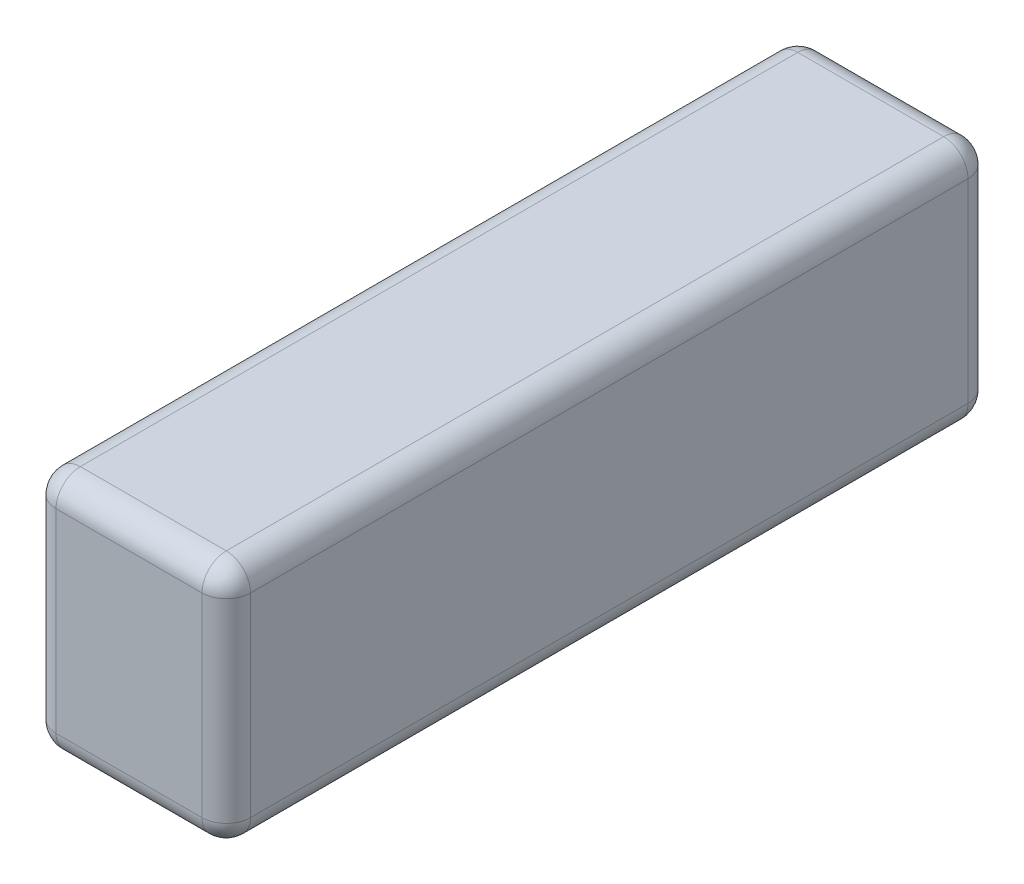
ISO-10303-21;
HEADER;
FILE_DESCRIPTION(('STEP AP214'),'2;1');
FILE_NAME('part.step','',(''),(''),'','','');
FILE_SCHEMA(('AUTOMOTIVE_DESIGN { 1 0 10303 214 1 1 1 1 }'));
ENDSEC;
DATA;
#1=APPLICATION_CONTEXT('core data for automotive mechanical design processes');
#2=APPLICATION_PROTOCOL_DEFINITION('international standard','automotive_design',2000,#1);
#3=PRODUCT_CONTEXT('',#1,'mechanical');
#4=PRODUCT('Part','Part','',(#3));
#5=PRODUCT_RELATED_PRODUCT_CATEGORY('part','',(#4));
#6=PRODUCT_DEFINITION_FORMATION('','',#4);
#7=PRODUCT_DEFINITION_CONTEXT('part definition',#1,'design');
#8=PRODUCT_DEFINITION('design','',#6,#7);
#9=PRODUCT_DEFINITION_SHAPE('','',#8);
#10=(LENGTH_UNIT() NAMED_UNIT(*) SI_UNIT(.MILLI.,.METRE.));
#11=(NAMED_UNIT(*) PLANE_ANGLE_UNIT() SI_UNIT($,.RADIAN.));
#12=(NAMED_UNIT(*) SI_UNIT($,.STERADIAN.) SOLID_ANGLE_UNIT());
#13=UNCERTAINTY_MEASURE_WITH_UNIT(LENGTH_MEASURE(1.E-05),#10,'distance_accuracy_value','');
#14=(GEOMETRIC_REPRESENTATION_CONTEXT(3) GLOBAL_UNCERTAINTY_ASSIGNED_CONTEXT((#13)) GLOBAL_UNIT_ASSIGNED_CONTEXT((#10,
#11,#12)) REPRESENTATION_CONTEXT('',''));
#15=CARTESIAN_POINT('',(0.,0.,0.));
#16=DIRECTION('',(0.,0.,1.));
#17=DIRECTION('',(1.,0.,0.));
#18=AXIS2_PLACEMENT_3D('',#15,#16,#17);
#19=CARTESIAN_POINT('',(8.,10.,63.));
#20=DIRECTION('',(-1.,0.,0.));
#21=DIRECTION('',(0.,-1.,0.));
#22=AXIS2_PLACEMENT_3D('',#19,#20,#21);
#23=PLANE('',#22);
#24=DIRECTION('',(0.,1.,0.));
#25=VECTOR('',#24,1.);
#26=CARTESIAN_POINT('',(8.00000000000001,-10.,61.));
#27=LINE('',#26,#25);
#28=CARTESIAN_POINT('',(8.,8.,61.));
#29=VERTEX_POINT('',#28);
#30=CARTESIAN_POINT('',(8.00000000000001,-8.,61.));
#31=VERTEX_POINT('',#30);
#32=EDGE_CURVE('E135',#29,#31,#27,.F.);
#33=ORIENTED_EDGE('',*,*,#32,.T.);
#34=DIRECTION('',(0.,0.,-1.));
#35=VECTOR('',#34,1.);
#36=CARTESIAN_POINT('',(8.00000000000001,-8.,63.));
#37=LINE('',#36,#35);
#38=CARTESIAN_POINT('',(8.00000000000001,-8.,2.));
#39=VERTEX_POINT('',#38);
#40=EDGE_CURVE('E171',#31,#39,#37,.T.);
#41=ORIENTED_EDGE('',*,*,#40,.T.);
#42=DIRECTION('',(0.,1.,0.));
#43=VECTOR('',#42,1.);
#44=CARTESIAN_POINT('',(8.,10.,2.));
#45=LINE('',#44,#43);
#46=CARTESIAN_POINT('',(8.,8.,2.));
#47=VERTEX_POINT('',#46);
#48=EDGE_CURVE('E164',#39,#47,#45,.T.);
#49=ORIENTED_EDGE('',*,*,#48,.T.);
#50=DIRECTION('',(0.,0.,-1.));
#51=VECTOR('',#50,1.);
#52=CARTESIAN_POINT('',(8.,8.,63.));
#53=LINE('',#52,#51);
#54=EDGE_CURVE('E162',#47,#29,#53,.F.);
#55=ORIENTED_EDGE('',*,*,#54,.T.);
#56=EDGE_LOOP('',(#33,#41,#49,#55));
#57=FACE_BOUND('',#56,.T.);
#58=ADVANCED_FACE('F39',(#57),#23,.F.);
#59=CARTESIAN_POINT('',(-8.,10.,63.));
#60=DIRECTION('',(0.,-1.,0.));
#61=DIRECTION('',(0.,0.,-1.));
#62=AXIS2_PLACEMENT_3D('',#59,#60,#61);
#63=PLANE('',#62);
#64=DIRECTION('',(-1.,0.,0.));
#65=VECTOR('',#64,1.);
#66=CARTESIAN_POINT('',(8.,10.,61.));
#67=LINE('',#66,#65);
#68=CARTESIAN_POINT('',(-6.,10.,61.));
#69=VERTEX_POINT('',#68);
#70=CARTESIAN_POINT('',(6.,10.,61.));
#71=VERTEX_POINT('',#70);
#72=EDGE_CURVE('E48',#69,#71,#67,.F.);
#73=ORIENTED_EDGE('',*,*,#72,.T.);
#74=DIRECTION('',(0.,0.,-1.));
#75=VECTOR('',#74,1.);
#76=CARTESIAN_POINT('',(6.,10.,63.));
#77=LINE('',#76,#75);
#78=CARTESIAN_POINT('',(6.,10.,2.));
#79=VERTEX_POINT('',#78);
#80=EDGE_CURVE('E11',#71,#79,#77,.T.);
#81=ORIENTED_EDGE('',*,*,#80,.T.);
#82=DIRECTION('',(-1.,0.,0.));
#83=VECTOR('',#82,1.);
#84=CARTESIAN_POINT('',(-8.,10.,2.));
#85=LINE('',#84,#83);
#86=CARTESIAN_POINT('',(-6.,10.,2.));
#87=VERTEX_POINT('',#86);
#88=EDGE_CURVE('E200',#79,#87,#85,.T.);
#89=ORIENTED_EDGE('',*,*,#88,.T.);
#90=DIRECTION('',(0.,0.,-1.));
#91=VECTOR('',#90,1.);
#92=CARTESIAN_POINT('',(-6.,10.,63.));
#93=LINE('',#92,#91);
#94=EDGE_CURVE('E59',#87,#69,#93,.F.);
#95=ORIENTED_EDGE('',*,*,#94,.T.);
#96=EDGE_LOOP('',(#73,#81,#89,#95));
#97=FACE_BOUND('',#96,.T.);
#98=ADVANCED_FACE('F333',(#97),#63,.F.);
#99=CARTESIAN_POINT('',(-8.,10.,63.));
#100=DIRECTION('',(1.,0.,0.));
#101=DIRECTION('',(0.,1.,0.));
#102=AXIS2_PLACEMENT_3D('',#99,#100,#101);
#103=PLANE('',#102);
#104=DIRECTION('',(0.,0.,-1.));
#105=VECTOR('',#104,1.);
#106=CARTESIAN_POINT('',(-8.,-8.,63.));
#107=LINE('',#106,#105);
#108=CARTESIAN_POINT('',(-8.,-8.,2.));
#109=VERTEX_POINT('',#108);
#110=CARTESIAN_POINT('',(-8.,-8.,61.));
#111=VERTEX_POINT('',#110);
#112=EDGE_CURVE('E195',#109,#111,#107,.F.);
#113=ORIENTED_EDGE('',*,*,#112,.T.);
#114=DIRECTION('',(0.,-1.,0.));
#115=VECTOR('',#114,1.);
#116=CARTESIAN_POINT('',(-8.,10.,61.));
#117=LINE('',#116,#115);
#118=CARTESIAN_POINT('',(-8.,8.,61.));
#119=VERTEX_POINT('',#118);
#120=EDGE_CURVE('E197',#111,#119,#117,.F.);
#121=ORIENTED_EDGE('',*,*,#120,.T.);
#122=DIRECTION('',(0.,0.,-1.));
#123=VECTOR('',#122,1.);
#124=CARTESIAN_POINT('',(-8.,8.,63.));
#125=LINE('',#124,#123);
#126=CARTESIAN_POINT('',(-8.,8.,2.));
#127=VERTEX_POINT('',#126);
#128=EDGE_CURVE('E191',#119,#127,#125,.T.);
#129=ORIENTED_EDGE('',*,*,#128,.T.);
#130=DIRECTION('',(0.,-1.,0.));
#131=VECTOR('',#130,1.);
#132=CARTESIAN_POINT('',(-8.,10.,2.));
#133=LINE('',#132,#131);
#134=EDGE_CURVE('E193',#127,#109,#133,.T.);
#135=ORIENTED_EDGE('',*,*,#134,.T.);
#136=EDGE_LOOP('',(#113,#121,#129,#135));
#137=FACE_BOUND('',#136,.T.);
#138=ADVANCED_FACE('F284',(#137),#103,.F.);
#139=CARTESIAN_POINT('',(-8.,-10.,63.));
#140=DIRECTION('',(0.,1.,0.));
#141=DIRECTION('',(0.,0.,1.));
#142=AXIS2_PLACEMENT_3D('',#139,#140,#141);
#143=PLANE('',#142);
#144=DIRECTION('',(0.,0.,-1.));
#145=VECTOR('',#144,1.);
#146=CARTESIAN_POINT('',(6.00000000000001,-10.,63.));
#147=LINE('',#146,#145);
#148=CARTESIAN_POINT('',(6.00000000000001,-10.,2.));
#149=VERTEX_POINT('',#148);
#150=CARTESIAN_POINT('',(6.00000000000001,-10.,61.));
#151=VERTEX_POINT('',#150);
#152=EDGE_CURVE('E186',#149,#151,#147,.F.);
#153=ORIENTED_EDGE('',*,*,#152,.T.);
#154=DIRECTION('',(1.,0.,0.));
#155=VECTOR('',#154,1.);
#156=CARTESIAN_POINT('',(-8.,-10.,61.));
#157=LINE('',#156,#155);
#158=CARTESIAN_POINT('',(-6.,-10.,61.));
#159=VERTEX_POINT('',#158);
#160=EDGE_CURVE('E188',#151,#159,#157,.F.);
#161=ORIENTED_EDGE('',*,*,#160,.T.);
#162=DIRECTION('',(0.,0.,-1.));
#163=VECTOR('',#162,1.);
#164=CARTESIAN_POINT('',(-6.,-10.,63.));
#165=LINE('',#164,#163);
#166=CARTESIAN_POINT('',(-6.,-10.,2.));
#167=VERTEX_POINT('',#166);
#168=EDGE_CURVE('E182',#159,#167,#165,.T.);
#169=ORIENTED_EDGE('',*,*,#168,.T.);
#170=DIRECTION('',(1.,0.,0.));
#171=VECTOR('',#170,1.);
#172=CARTESIAN_POINT('',(-8.,-10.,2.));
#173=LINE('',#172,#171);
#174=EDGE_CURVE('E184',#167,#149,#173,.T.);
#175=ORIENTED_EDGE('',*,*,#174,.T.);
#176=EDGE_LOOP('',(#153,#161,#169,#175));
#177=FACE_BOUND('',#176,.T.);
#178=ADVANCED_FACE('F275',(#177),#143,.F.);
#179=CARTESIAN_POINT('',(0.,0.,63.));
#180=DIRECTION('',(0.,0.,1.));
#181=DIRECTION('',(1.,0.,0.));
#182=AXIS2_PLACEMENT_3D('',#179,#180,#181);
#183=PLANE('',#182);
#184=DIRECTION('',(1.,0.,0.));
#185=VECTOR('',#184,1.);
#186=CARTESIAN_POINT('',(8.00000000000001,-8.,63.));
#187=LINE('',#186,#185);
#188=CARTESIAN_POINT('',(-6.,-8.,63.));
#189=VERTEX_POINT('',#188);
#190=CARTESIAN_POINT('',(6.00000000000001,-8.,63.));
#191=VERTEX_POINT('',#190);
#192=EDGE_CURVE('E160',#189,#191,#187,.T.);
#193=ORIENTED_EDGE('',*,*,#192,.T.);
#194=DIRECTION('',(0.,1.,0.));
#195=VECTOR('',#194,1.);
#196=CARTESIAN_POINT('',(6.,10.,63.));
#197=LINE('',#196,#195);
#198=CARTESIAN_POINT('',(6.,8.,63.));
#199=VERTEX_POINT('',#198);
#200=EDGE_CURVE('E133',#191,#199,#197,.T.);
#201=ORIENTED_EDGE('',*,*,#200,.T.);
#202=DIRECTION('',(-1.,0.,0.));
#203=VECTOR('',#202,1.);
#204=CARTESIAN_POINT('',(-8.,8.,63.));
#205=LINE('',#204,#203);
#206=CARTESIAN_POINT('',(-6.,8.,63.));
#207=VERTEX_POINT('',#206);
#208=EDGE_CURVE('E150',#199,#207,#205,.T.);
#209=ORIENTED_EDGE('',*,*,#208,.T.);
#210=DIRECTION('',(0.,-1.,0.));
#211=VECTOR('',#210,1.);
#212=CARTESIAN_POINT('',(-6.,-10.,63.));
#213=LINE('',#212,#211);
#214=EDGE_CURVE('E156',#207,#189,#213,.T.);
#215=ORIENTED_EDGE('',*,*,#214,.T.);
#216=EDGE_LOOP('',(#193,#201,#209,#215));
#217=FACE_BOUND('',#216,.T.);
#218=ADVANCED_FACE('F158',(#217),#183,.T.);
#219=CARTESIAN_POINT('',(0.,0.,0.));
#220=DIRECTION('',(0.,0.,1.));
#221=DIRECTION('',(1.,0.,0.));
#222=AXIS2_PLACEMENT_3D('',#219,#220,#221);
#223=PLANE('',#222);
#224=DIRECTION('',(-1.,0.,0.));
#225=VECTOR('',#224,1.);
#226=CARTESIAN_POINT('',(0.,8.,0.));
#227=LINE('',#226,#225);
#228=CARTESIAN_POINT('',(-6.,8.,0.));
#229=VERTEX_POINT('',#228);
#230=CARTESIAN_POINT('',(6.,8.,0.));
#231=VERTEX_POINT('',#230);
#232=EDGE_CURVE('E173',#229,#231,#227,.F.);
#233=ORIENTED_EDGE('',*,*,#232,.T.);
#234=DIRECTION('',(0.,1.,0.));
#235=VECTOR('',#234,1.);
#236=CARTESIAN_POINT('',(6.,0.,0.));
#237=LINE('',#236,#235);
#238=CARTESIAN_POINT('',(6.00000000000001,-8.,0.));
#239=VERTEX_POINT('',#238);
#240=EDGE_CURVE('E179',#231,#239,#237,.F.);
#241=ORIENTED_EDGE('',*,*,#240,.T.);
#242=DIRECTION('',(1.,0.,0.));
#243=VECTOR('',#242,1.);
#244=CARTESIAN_POINT('',(0.,-8.,0.));
#245=LINE('',#244,#243);
#246=CARTESIAN_POINT('',(-6.,-8.,0.));
#247=VERTEX_POINT('',#246);
#248=EDGE_CURVE('E177',#239,#247,#245,.F.);
#249=ORIENTED_EDGE('',*,*,#248,.T.);
#250=DIRECTION('',(0.,-1.,0.));
#251=VECTOR('',#250,1.);
#252=CARTESIAN_POINT('',(-6.,0.,0.));
#253=LINE('',#252,#251);
#254=EDGE_CURVE('E175',#247,#229,#253,.F.);
#255=ORIENTED_EDGE('',*,*,#254,.T.);
#256=EDGE_LOOP('',(#233,#241,#249,#255));
#257=FACE_BOUND('',#256,.T.);
#258=ADVANCED_FACE('F302',(#257),#223,.F.);
#259=CARTESIAN_POINT('',(-6.,10.,2.));
#260=DIRECTION('',(0.,-1.,0.));
#261=DIRECTION('',(1.,0.,0.));
#262=AXIS2_PLACEMENT_3D('',#259,#260,#261);
#263=CYLINDRICAL_SURFACE('',#262,2.);
#264=CARTESIAN_POINT('',(-6.,-8.,2.));
#265=DIRECTION('',(0.,-1.,0.));
#266=DIRECTION('',(0.,0.,-1.));
#267=AXIS2_PLACEMENT_3D('',#264,#265,#266);
#268=CIRCLE('',#267,2.);
#269=EDGE_CURVE('E43',#109,#247,#268,.T.);
#270=ORIENTED_EDGE('',*,*,#269,.F.);
#271=ORIENTED_EDGE('',*,*,#134,.F.);
#272=CARTESIAN_POINT('',(-6.,8.,2.));
#273=DIRECTION('',(0.,1.,0.));
#274=DIRECTION('',(0.,0.,1.));
#275=AXIS2_PLACEMENT_3D('',#272,#273,#274);
#276=CIRCLE('',#275,2.);
#277=EDGE_CURVE('E252',#229,#127,#276,.T.);
#278=ORIENTED_EDGE('',*,*,#277,.F.);
#279=ORIENTED_EDGE('',*,*,#254,.F.);
#280=EDGE_LOOP('',(#270,#271,#278,#279));
#281=FACE_BOUND('',#280,.T.);
#282=ADVANCED_FACE('F41',(#281),#263,.T.);
#283=CARTESIAN_POINT('',(-6.,-8.,2.));
#284=DIRECTION('',(0.,0.,1.));
#285=DIRECTION('',(1.,0.,0.));
#286=AXIS2_PLACEMENT_3D('',#283,#284,#285);
#287=SPHERICAL_SURFACE('',#286,2.);
#288=CARTESIAN_POINT('',(-6.,-8.,2.));
#289=DIRECTION('',(0.,0.,-1.));
#290=DIRECTION('',(-1.,0.,0.));
#291=AXIS2_PLACEMENT_3D('',#288,#289,#290);
#292=CIRCLE('',#291,2.);
#293=EDGE_CURVE('E247',#109,#167,#292,.F.);
#294=ORIENTED_EDGE('',*,*,#293,.F.);
#295=ORIENTED_EDGE('',*,*,#269,.T.);
#296=CARTESIAN_POINT('',(-6.,-8.,2.));
#297=DIRECTION('',(-1.,0.,0.));
#298=DIRECTION('',(0.,0.,1.));
#299=AXIS2_PLACEMENT_3D('',#296,#297,#298);
#300=CIRCLE('',#299,2.);
#301=EDGE_CURVE('E250',#167,#247,#300,.F.);
#302=ORIENTED_EDGE('',*,*,#301,.F.);
#303=EDGE_LOOP('',(#294,#295,#302));
#304=FACE_BOUND('',#303,.T.);
#305=ADVANCED_FACE('F263',(#304),#287,.T.);
#306=CARTESIAN_POINT('',(-6.,8.,2.));
#307=DIRECTION('',(0.,0.,1.));
#308=DIRECTION('',(1.,0.,0.));
#309=AXIS2_PLACEMENT_3D('',#306,#307,#308);
#310=SPHERICAL_SURFACE('',#309,2.);
#311=CARTESIAN_POINT('',(-6.,8.,2.));
#312=DIRECTION('',(-1.,0.,0.));
#313=DIRECTION('',(0.,0.,1.));
#314=AXIS2_PLACEMENT_3D('',#311,#312,#313);
#315=CIRCLE('',#314,2.);
#316=EDGE_CURVE('E241',#229,#87,#315,.F.);
#317=ORIENTED_EDGE('',*,*,#316,.F.);
#318=ORIENTED_EDGE('',*,*,#277,.T.);
#319=CARTESIAN_POINT('',(-6.,8.,2.));
#320=DIRECTION('',(0.,0.,-1.));
#321=DIRECTION('',(-1.,0.,0.));
#322=AXIS2_PLACEMENT_3D('',#319,#320,#321);
#323=CIRCLE('',#322,2.);
#324=EDGE_CURVE('E244',#87,#127,#323,.F.);
#325=ORIENTED_EDGE('',*,*,#324,.F.);
#326=EDGE_LOOP('',(#317,#318,#325));
#327=FACE_BOUND('',#326,.T.);
#328=ADVANCED_FACE('F295',(#327),#310,.T.);
#329=CARTESIAN_POINT('',(-8.,-8.,2.));
#330=DIRECTION('',(1.,0.,0.));
#331=DIRECTION('',(0.,0.,-1.));
#332=AXIS2_PLACEMENT_3D('',#329,#330,#331);
#333=CYLINDRICAL_SURFACE('',#332,2.);
#334=ORIENTED_EDGE('',*,*,#301,.T.);
#335=ORIENTED_EDGE('',*,*,#248,.F.);
#336=CARTESIAN_POINT('',(6.00000000000001,-8.,2.));
#337=DIRECTION('',(1.,0.,0.));
#338=DIRECTION('',(0.,0.,-1.));
#339=AXIS2_PLACEMENT_3D('',#336,#337,#338);
#340=CIRCLE('',#339,2.);
#341=EDGE_CURVE('E236',#149,#239,#340,.T.);
#342=ORIENTED_EDGE('',*,*,#341,.F.);
#343=ORIENTED_EDGE('',*,*,#174,.F.);
#344=EDGE_LOOP('',(#334,#335,#342,#343));
#345=FACE_BOUND('',#344,.T.);
#346=ADVANCED_FACE('F271',(#345),#333,.T.);
#347=CARTESIAN_POINT('',(-6.,-8.,63.));
#348=DIRECTION('',(0.,0.,-1.));
#349=DIRECTION('',(-1.,0.,0.));
#350=AXIS2_PLACEMENT_3D('',#347,#348,#349);
#351=CYLINDRICAL_SURFACE('',#350,2.);
#352=ORIENTED_EDGE('',*,*,#293,.T.);
#353=ORIENTED_EDGE('',*,*,#168,.F.);
#354=CARTESIAN_POINT('',(-6.,-8.,61.));
#355=DIRECTION('',(0.,0.,1.));
#356=DIRECTION('',(1.,0.,0.));
#357=AXIS2_PLACEMENT_3D('',#354,#355,#356);
#358=CIRCLE('',#357,2.);
#359=EDGE_CURVE('E233',#111,#159,#358,.T.);
#360=ORIENTED_EDGE('',*,*,#359,.F.);
#361=ORIENTED_EDGE('',*,*,#112,.F.);
#362=EDGE_LOOP('',(#352,#353,#360,#361));
#363=FACE_BOUND('',#362,.T.);
#364=ADVANCED_FACE('F281',(#363),#351,.T.);
#365=CARTESIAN_POINT('',(-6.,0.,61.));
#366=DIRECTION('',(0.,1.,0.));
#367=DIRECTION('',(-1.,0.,0.));
#368=AXIS2_PLACEMENT_3D('',#365,#366,#367);
#369=CYLINDRICAL_SURFACE('',#368,2.);
#370=CARTESIAN_POINT('',(-6.,8.,61.));
#371=DIRECTION('',(0.,1.,0.));
#372=DIRECTION('',(0.,0.,1.));
#373=AXIS2_PLACEMENT_3D('',#370,#371,#372);
#374=CIRCLE('',#373,2.);
#375=EDGE_CURVE('E227',#119,#207,#374,.T.);
#376=ORIENTED_EDGE('',*,*,#375,.F.);
#377=ORIENTED_EDGE('',*,*,#120,.F.);
#378=CARTESIAN_POINT('',(-6.,-8.,61.));
#379=DIRECTION('',(0.,-1.,0.));
#380=DIRECTION('',(0.,0.,-1.));
#381=AXIS2_PLACEMENT_3D('',#378,#379,#380);
#382=CIRCLE('',#381,2.);
#383=EDGE_CURVE('E230',#189,#111,#382,.T.);
#384=ORIENTED_EDGE('',*,*,#383,.F.);
#385=ORIENTED_EDGE('',*,*,#214,.F.);
#386=EDGE_LOOP('',(#376,#377,#384,#385));
#387=FACE_BOUND('',#386,.T.);
#388=ADVANCED_FACE('F288',(#387),#369,.T.);
#389=CARTESIAN_POINT('',(-6.,8.,63.));
#390=DIRECTION('',(0.,0.,-1.));
#391=DIRECTION('',(-1.,0.,0.));
#392=AXIS2_PLACEMENT_3D('',#389,#390,#391);
#393=CYLINDRICAL_SURFACE('',#392,2.);
#394=ORIENTED_EDGE('',*,*,#324,.T.);
#395=ORIENTED_EDGE('',*,*,#128,.F.);
#396=CARTESIAN_POINT('',(-6.,8.,61.));
#397=DIRECTION('',(0.,0.,1.));
#398=DIRECTION('',(1.,0.,0.));
#399=AXIS2_PLACEMENT_3D('',#396,#397,#398);
#400=CIRCLE('',#399,2.);
#401=EDGE_CURVE('E225',#69,#119,#400,.T.);
#402=ORIENTED_EDGE('',*,*,#401,.F.);
#403=ORIENTED_EDGE('',*,*,#94,.F.);
#404=EDGE_LOOP('',(#394,#395,#402,#403));
#405=FACE_BOUND('',#404,.T.);
#406=ADVANCED_FACE('F293',(#405),#393,.T.);
#407=CARTESIAN_POINT('',(-8.,8.,2.));
#408=DIRECTION('',(-1.,0.,0.));
#409=DIRECTION('',(0.,0.,1.));
#410=AXIS2_PLACEMENT_3D('',#407,#408,#409);
#411=CYLINDRICAL_SURFACE('',#410,2.);
#412=ORIENTED_EDGE('',*,*,#316,.T.);
#413=ORIENTED_EDGE('',*,*,#88,.F.);
#414=CARTESIAN_POINT('',(6.,8.,2.));
#415=DIRECTION('',(1.,0.,0.));
#416=DIRECTION('',(0.,1.,0.));
#417=AXIS2_PLACEMENT_3D('',#414,#415,#416);
#418=CIRCLE('',#417,2.);
#419=EDGE_CURVE('E222',#231,#79,#418,.T.);
#420=ORIENTED_EDGE('',*,*,#419,.F.);
#421=ORIENTED_EDGE('',*,*,#232,.F.);
#422=EDGE_LOOP('',(#412,#413,#420,#421));
#423=FACE_BOUND('',#422,.T.);
#424=ADVANCED_FACE('F299',(#423),#411,.T.);
#425=CARTESIAN_POINT('',(6.,10.,2.));
#426=DIRECTION('',(0.,1.,0.));
#427=DIRECTION('',(-1.,0.,0.));
#428=AXIS2_PLACEMENT_3D('',#425,#426,#427);
#429=CYLINDRICAL_SURFACE('',#428,2.);
#430=CARTESIAN_POINT('',(6.00000000000001,-8.,2.));
#431=DIRECTION('',(0.,-1.,0.));
#432=DIRECTION('',(1.,0.,0.));
#433=AXIS2_PLACEMENT_3D('',#430,#431,#432);
#434=CIRCLE('',#433,2.);
#435=EDGE_CURVE('E238',#239,#39,#434,.T.);
#436=ORIENTED_EDGE('',*,*,#435,.F.);
#437=ORIENTED_EDGE('',*,*,#240,.F.);
#438=CARTESIAN_POINT('',(6.,8.,2.));
#439=DIRECTION('',(0.,1.,0.));
#440=DIRECTION('',(0.,0.,1.));
#441=AXIS2_PLACEMENT_3D('',#438,#439,#440);
#442=CIRCLE('',#441,2.);
#443=EDGE_CURVE('E219',#47,#231,#442,.T.);
#444=ORIENTED_EDGE('',*,*,#443,.F.);
#445=ORIENTED_EDGE('',*,*,#48,.F.);
#446=EDGE_LOOP('',(#436,#437,#444,#445));
#447=FACE_BOUND('',#446,.T.);
#448=ADVANCED_FACE('F306',(#447),#429,.T.);
#449=CARTESIAN_POINT('',(6.00000000000001,-8.,2.));
#450=DIRECTION('',(0.,0.,1.));
#451=DIRECTION('',(1.,0.,0.));
#452=AXIS2_PLACEMENT_3D('',#449,#450,#451);
#453=SPHERICAL_SURFACE('',#452,2.);
#454=ORIENTED_EDGE('',*,*,#341,.T.);
#455=ORIENTED_EDGE('',*,*,#435,.T.);
#456=CARTESIAN_POINT('',(6.00000000000001,-8.,2.));
#457=DIRECTION('',(0.,0.,-1.));
#458=DIRECTION('',(-1.,0.,0.));
#459=AXIS2_PLACEMENT_3D('',#456,#457,#458);
#460=CIRCLE('',#459,2.);
#461=EDGE_CURVE('E216',#149,#39,#460,.F.);
#462=ORIENTED_EDGE('',*,*,#461,.F.);
#463=EDGE_LOOP('',(#454,#455,#462));
#464=FACE_BOUND('',#463,.T.);
#465=ADVANCED_FACE('F310',(#464),#453,.T.);
#466=CARTESIAN_POINT('',(-6.,-8.,61.));
#467=DIRECTION('',(0.,0.,1.));
#468=DIRECTION('',(1.,0.,0.));
#469=AXIS2_PLACEMENT_3D('',#466,#467,#468);
#470=SPHERICAL_SURFACE('',#469,2.);
#471=ORIENTED_EDGE('',*,*,#383,.T.);
#472=ORIENTED_EDGE('',*,*,#359,.T.);
#473=CARTESIAN_POINT('',(-6.,-8.,61.));
#474=DIRECTION('',(-1.,0.,0.));
#475=DIRECTION('',(0.,0.,1.));
#476=AXIS2_PLACEMENT_3D('',#473,#474,#475);
#477=CIRCLE('',#476,2.);
#478=EDGE_CURVE('E214',#189,#159,#477,.F.);
#479=ORIENTED_EDGE('',*,*,#478,.F.);
#480=EDGE_LOOP('',(#471,#472,#479));
#481=FACE_BOUND('',#480,.T.);
#482=ADVANCED_FACE('F321',(#481),#470,.T.);
#483=CARTESIAN_POINT('',(-6.,8.,61.));
#484=DIRECTION('',(0.,0.,1.));
#485=DIRECTION('',(1.,0.,0.));
#486=AXIS2_PLACEMENT_3D('',#483,#484,#485);
#487=SPHERICAL_SURFACE('',#486,2.);
#488=ORIENTED_EDGE('',*,*,#401,.T.);
#489=ORIENTED_EDGE('',*,*,#375,.T.);
#490=CARTESIAN_POINT('',(-6.,8.,61.));
#491=DIRECTION('',(-1.,0.,0.));
#492=DIRECTION('',(0.,0.,1.));
#493=AXIS2_PLACEMENT_3D('',#490,#491,#492);
#494=CIRCLE('',#493,2.);
#495=EDGE_CURVE('E153',#69,#207,#494,.F.);
#496=ORIENTED_EDGE('',*,*,#495,.F.);
#497=EDGE_LOOP('',(#488,#489,#496));
#498=FACE_BOUND('',#497,.T.);
#499=ADVANCED_FACE('F323',(#498),#487,.T.);
#500=CARTESIAN_POINT('',(6.,8.,2.));
#501=DIRECTION('',(0.,0.,1.));
#502=DIRECTION('',(1.,0.,0.));
#503=AXIS2_PLACEMENT_3D('',#500,#501,#502);
#504=SPHERICAL_SURFACE('',#503,2.);
#505=ORIENTED_EDGE('',*,*,#443,.T.);
#506=ORIENTED_EDGE('',*,*,#419,.T.);
#507=CARTESIAN_POINT('',(6.,8.,2.));
#508=DIRECTION('',(0.,0.,-1.));
#509=DIRECTION('',(-1.,0.,0.));
#510=AXIS2_PLACEMENT_3D('',#507,#508,#509);
#511=CIRCLE('',#510,2.);
#512=EDGE_CURVE('E211',#47,#79,#511,.F.);
#513=ORIENTED_EDGE('',*,*,#512,.F.);
#514=EDGE_LOOP('',(#505,#506,#513));
#515=FACE_BOUND('',#514,.T.);
#516=ADVANCED_FACE('F329',(#515),#504,.T.);
#517=CARTESIAN_POINT('',(6.00000000000001,-8.,63.));
#518=DIRECTION('',(0.,0.,-1.));
#519=DIRECTION('',(-1.,0.,0.));
#520=AXIS2_PLACEMENT_3D('',#517,#518,#519);
#521=CYLINDRICAL_SURFACE('',#520,2.);
#522=ORIENTED_EDGE('',*,*,#461,.T.);
#523=ORIENTED_EDGE('',*,*,#40,.F.);
#524=CARTESIAN_POINT('',(6.00000000000001,-8.,61.));
#525=DIRECTION('',(0.,0.,1.));
#526=DIRECTION('',(1.,0.,0.));
#527=AXIS2_PLACEMENT_3D('',#524,#525,#526);
#528=CIRCLE('',#527,2.);
#529=EDGE_CURVE('E208',#151,#31,#528,.T.);
#530=ORIENTED_EDGE('',*,*,#529,.F.);
#531=ORIENTED_EDGE('',*,*,#152,.F.);
#532=EDGE_LOOP('',(#522,#523,#530,#531));
#533=FACE_BOUND('',#532,.T.);
#534=ADVANCED_FACE('F313',(#533),#521,.T.);
#535=CARTESIAN_POINT('',(0.,-8.,61.));
#536=DIRECTION('',(-1.,0.,0.));
#537=DIRECTION('',(0.,0.,1.));
#538=AXIS2_PLACEMENT_3D('',#535,#536,#537);
#539=CYLINDRICAL_SURFACE('',#538,2.);
#540=ORIENTED_EDGE('',*,*,#478,.T.);
#541=ORIENTED_EDGE('',*,*,#160,.F.);
#542=CARTESIAN_POINT('',(6.00000000000001,-8.,61.));
#543=DIRECTION('',(1.,0.,0.));
#544=DIRECTION('',(0.,0.,-1.));
#545=AXIS2_PLACEMENT_3D('',#542,#543,#544);
#546=CIRCLE('',#545,2.);
#547=EDGE_CURVE('E147',#191,#151,#546,.T.);
#548=ORIENTED_EDGE('',*,*,#547,.F.);
#549=ORIENTED_EDGE('',*,*,#192,.F.);
#550=EDGE_LOOP('',(#540,#541,#548,#549));
#551=FACE_BOUND('',#550,.T.);
#552=ADVANCED_FACE('F319',(#551),#539,.T.);
#553=CARTESIAN_POINT('',(0.,8.,61.));
#554=DIRECTION('',(1.,0.,0.));
#555=DIRECTION('',(0.,0.,-1.));
#556=AXIS2_PLACEMENT_3D('',#553,#554,#555);
#557=CYLINDRICAL_SURFACE('',#556,2.);
#558=ORIENTED_EDGE('',*,*,#495,.T.);
#559=ORIENTED_EDGE('',*,*,#208,.F.);
#560=CARTESIAN_POINT('',(6.,8.,61.));
#561=DIRECTION('',(1.,0.,0.));
#562=DIRECTION('',(0.,0.,-1.));
#563=AXIS2_PLACEMENT_3D('',#560,#561,#562);
#564=CIRCLE('',#563,2.);
#565=EDGE_CURVE('E141',#71,#199,#564,.T.);
#566=ORIENTED_EDGE('',*,*,#565,.F.);
#567=ORIENTED_EDGE('',*,*,#72,.F.);
#568=EDGE_LOOP('',(#558,#559,#566,#567));
#569=FACE_BOUND('',#568,.T.);
#570=ADVANCED_FACE('F151',(#569),#557,.T.);
#571=CARTESIAN_POINT('',(6.,8.,63.));
#572=DIRECTION('',(0.,0.,-1.));
#573=DIRECTION('',(-1.,0.,0.));
#574=AXIS2_PLACEMENT_3D('',#571,#572,#573);
#575=CYLINDRICAL_SURFACE('',#574,2.);
#576=ORIENTED_EDGE('',*,*,#512,.T.);
#577=ORIENTED_EDGE('',*,*,#80,.F.);
#578=CARTESIAN_POINT('',(6.,8.,61.));
#579=DIRECTION('',(0.,0.,1.));
#580=DIRECTION('',(1.,0.,0.));
#581=AXIS2_PLACEMENT_3D('',#578,#579,#580);
#582=CIRCLE('',#581,2.);
#583=EDGE_CURVE('E145',#29,#71,#582,.T.);
#584=ORIENTED_EDGE('',*,*,#583,.F.);
#585=ORIENTED_EDGE('',*,*,#54,.F.);
#586=EDGE_LOOP('',(#576,#577,#584,#585));
#587=FACE_BOUND('',#586,.T.);
#588=ADVANCED_FACE('F348',(#587),#575,.T.);
#589=CARTESIAN_POINT('',(6.00000000000001,-8.,61.));
#590=DIRECTION('',(0.,0.,1.));
#591=DIRECTION('',(1.,0.,0.));
#592=AXIS2_PLACEMENT_3D('',#589,#590,#591);
#593=SPHERICAL_SURFACE('',#592,2.);
#594=ORIENTED_EDGE('',*,*,#547,.T.);
#595=ORIENTED_EDGE('',*,*,#529,.T.);
#596=CARTESIAN_POINT('',(6.00000000000001,-8.,61.));
#597=DIRECTION('',(0.,-1.,0.));
#598=DIRECTION('',(0.,0.,-1.));
#599=AXIS2_PLACEMENT_3D('',#596,#597,#598);
#600=CIRCLE('',#599,2.);
#601=EDGE_CURVE('E138',#191,#31,#600,.F.);
#602=ORIENTED_EDGE('',*,*,#601,.F.);
#603=EDGE_LOOP('',(#594,#595,#602));
#604=FACE_BOUND('',#603,.T.);
#605=ADVANCED_FACE('F317',(#604),#593,.T.);
#606=CARTESIAN_POINT('',(6.,8.,61.));
#607=DIRECTION('',(0.,0.,1.));
#608=DIRECTION('',(1.,0.,0.));
#609=AXIS2_PLACEMENT_3D('',#606,#607,#608);
#610=SPHERICAL_SURFACE('',#609,2.);
#611=ORIENTED_EDGE('',*,*,#583,.T.);
#612=ORIENTED_EDGE('',*,*,#565,.T.);
#613=CARTESIAN_POINT('',(6.,8.,61.));
#614=DIRECTION('',(0.,1.,0.));
#615=DIRECTION('',(0.,0.,1.));
#616=AXIS2_PLACEMENT_3D('',#613,#614,#615);
#617=CIRCLE('',#616,2.);
#618=EDGE_CURVE('E129',#29,#199,#617,.F.);
#619=ORIENTED_EDGE('',*,*,#618,.F.);
#620=EDGE_LOOP('',(#611,#612,#619));
#621=FACE_BOUND('',#620,.T.);
#622=ADVANCED_FACE('F143',(#621),#610,.T.);
#623=CARTESIAN_POINT('',(6.,0.,61.));
#624=DIRECTION('',(0.,-1.,0.));
#625=DIRECTION('',(1.,0.,0.));
#626=AXIS2_PLACEMENT_3D('',#623,#624,#625);
#627=CYLINDRICAL_SURFACE('',#626,2.);
#628=ORIENTED_EDGE('',*,*,#601,.T.);
#629=ORIENTED_EDGE('',*,*,#32,.F.);
#630=ORIENTED_EDGE('',*,*,#618,.T.);
#631=ORIENTED_EDGE('',*,*,#200,.F.);
#632=EDGE_LOOP('',(#628,#629,#630,#631));
#633=FACE_BOUND('',#632,.T.);
#634=ADVANCED_FACE('F131',(#633),#627,.T.);
#635=CLOSED_SHELL('',(#58,#98,#138,#178,#218,#258,#282,#305,#328,#346,#364,#388,#406,#424,#448,
#465,#482,#499,#516,#534,#552,#570,#588,#605,#622,#634));
#636=MANIFOLD_SOLID_BREP('B2',#635);
#637=ADVANCED_BREP_SHAPE_REPRESENTATION('',(#18,#636),#14);
#638=SHAPE_DEFINITION_REPRESENTATION(#9,#637);
ENDSEC;
END-ISO-10303-21;
